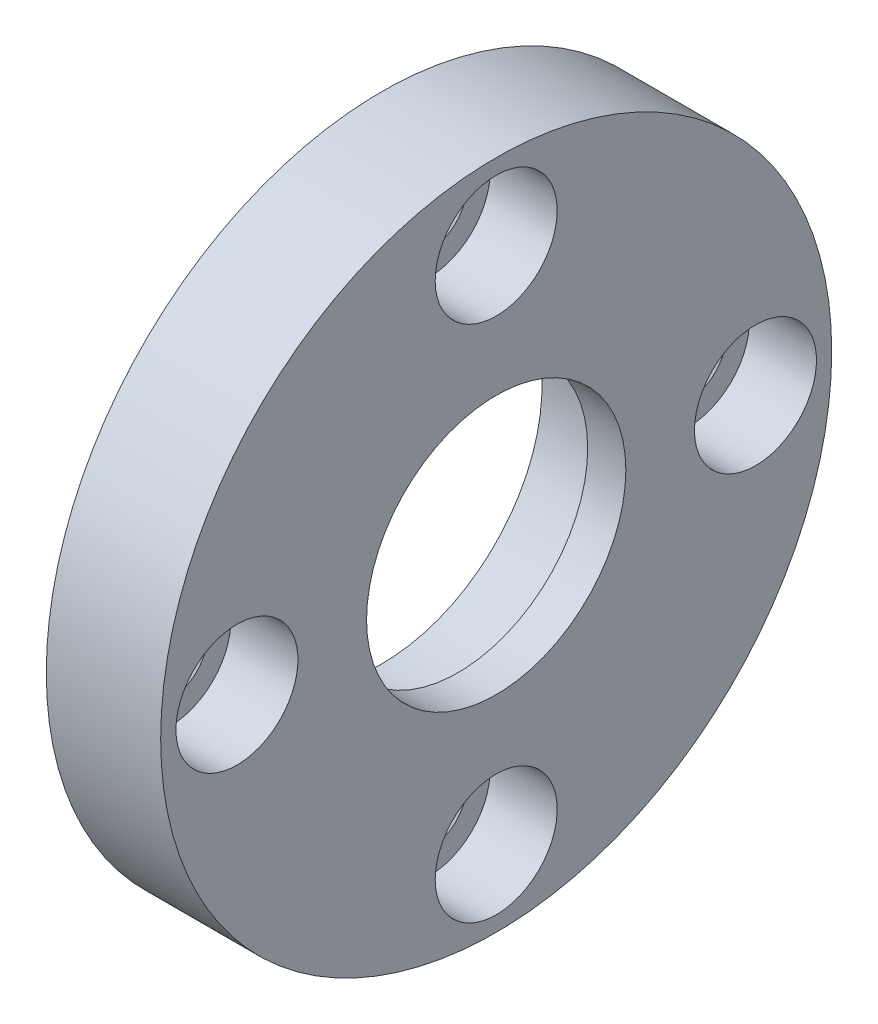
ISO-10303-21;
HEADER;
FILE_DESCRIPTION(('STEP AP214'),'2;1');
FILE_NAME('part.step','',(''),(''),'','','');
FILE_SCHEMA(('AUTOMOTIVE_DESIGN { 1 0 10303 214 1 1 1 1 }'));
ENDSEC;
DATA;
#1=APPLICATION_CONTEXT('core data for automotive mechanical design processes');
#2=APPLICATION_PROTOCOL_DEFINITION('international standard','automotive_design',2000,#1);
#3=PRODUCT_CONTEXT('',#1,'mechanical');
#4=PRODUCT('Part','Part','',(#3));
#5=PRODUCT_RELATED_PRODUCT_CATEGORY('part','',(#4));
#6=PRODUCT_DEFINITION_FORMATION('','',#4);
#7=PRODUCT_DEFINITION_CONTEXT('part definition',#1,'design');
#8=PRODUCT_DEFINITION('design','',#6,#7);
#9=PRODUCT_DEFINITION_SHAPE('','',#8);
#10=(LENGTH_UNIT() NAMED_UNIT(*) SI_UNIT(.MILLI.,.METRE.));
#11=(NAMED_UNIT(*) PLANE_ANGLE_UNIT() SI_UNIT($,.RADIAN.));
#12=(NAMED_UNIT(*) SI_UNIT($,.STERADIAN.) SOLID_ANGLE_UNIT());
#13=UNCERTAINTY_MEASURE_WITH_UNIT(LENGTH_MEASURE(1.E-05),#10,'distance_accuracy_value','');
#14=(GEOMETRIC_REPRESENTATION_CONTEXT(3) GLOBAL_UNCERTAINTY_ASSIGNED_CONTEXT((#13)) GLOBAL_UNIT_ASSIGNED_CONTEXT((#10,
#11,#12)) REPRESENTATION_CONTEXT('',''));
#15=CARTESIAN_POINT('',(0.,0.,0.));
#16=DIRECTION('',(0.,0.,1.));
#17=DIRECTION('',(1.,0.,0.));
#18=AXIS2_PLACEMENT_3D('',#15,#16,#17);
#19=CARTESIAN_POINT('',(-3.75,0.,0.));
#20=DIRECTION('',(1.,0.,0.));
#21=DIRECTION('',(0.,0.,-1.));
#22=AXIS2_PLACEMENT_3D('',#19,#20,#21);
#23=PLANE('',#22);
#24=CARTESIAN_POINT('',(-3.75,0.,-17.));
#25=DIRECTION('',(-1.,0.,0.));
#26=DIRECTION('',(0.,0.,1.));
#27=AXIS2_PLACEMENT_3D('',#24,#25,#26);
#28=CIRCLE('',#27,2.5);
#29=CARTESIAN_POINT('',(-3.75,0.,-14.5));
#30=VERTEX_POINT('',#29);
#31=EDGE_CURVE('E110',#30,#30,#28,.T.);
#32=ORIENTED_EDGE('',*,*,#31,.F.);
#33=EDGE_LOOP('',(#32));
#34=FACE_BOUND('',#33,.T.);
#35=CARTESIAN_POINT('',(-3.75,-17.,0.));
#36=DIRECTION('',(-1.,0.,0.));
#37=DIRECTION('',(0.,0.,1.));
#38=AXIS2_PLACEMENT_3D('',#35,#36,#37);
#39=CIRCLE('',#38,2.5);
#40=CARTESIAN_POINT('',(-3.75,-17.,2.5));
#41=VERTEX_POINT('',#40);
#42=EDGE_CURVE('E92',#41,#41,#39,.T.);
#43=ORIENTED_EDGE('',*,*,#42,.F.);
#44=EDGE_LOOP('',(#43));
#45=FACE_BOUND('',#44,.T.);
#46=CARTESIAN_POINT('',(-3.75,0.,17.));
#47=DIRECTION('',(-1.,0.,0.));
#48=DIRECTION('',(0.,0.,1.));
#49=AXIS2_PLACEMENT_3D('',#46,#47,#48);
#50=CIRCLE('',#49,2.5);
#51=CARTESIAN_POINT('',(-3.75,0.,19.5));
#52=VERTEX_POINT('',#51);
#53=EDGE_CURVE('E74',#52,#52,#50,.T.);
#54=ORIENTED_EDGE('',*,*,#53,.F.);
#55=EDGE_LOOP('',(#54));
#56=FACE_BOUND('',#55,.T.);
#57=CARTESIAN_POINT('',(-3.75,17.,0.));
#58=DIRECTION('',(-1.,0.,0.));
#59=DIRECTION('',(0.,0.,1.));
#60=AXIS2_PLACEMENT_3D('',#57,#58,#59);
#61=CIRCLE('',#60,2.5);
#62=CARTESIAN_POINT('',(-3.75,17.,2.5));
#63=VERTEX_POINT('',#62);
#64=EDGE_CURVE('E56',#63,#63,#61,.T.);
#65=ORIENTED_EDGE('',*,*,#64,.F.);
#66=EDGE_LOOP('',(#65));
#67=FACE_BOUND('',#66,.T.);
#68=CARTESIAN_POINT('',(-3.75,0.,0.));
#69=DIRECTION('',(-1.,0.,0.));
#70=DIRECTION('',(0.,0.,1.));
#71=AXIS2_PLACEMENT_3D('',#68,#69,#70);
#72=CIRCLE('',#71,10.5);
#73=CARTESIAN_POINT('',(-3.75,0.,10.5));
#74=VERTEX_POINT('',#73);
#75=EDGE_CURVE('E41',#74,#74,#72,.T.);
#76=ORIENTED_EDGE('',*,*,#75,.F.);
#77=EDGE_LOOP('',(#76));
#78=FACE_BOUND('',#77,.T.);
#79=CARTESIAN_POINT('',(-3.75,0.,0.));
#80=DIRECTION('',(-1.,0.,0.));
#81=DIRECTION('',(0.,0.,1.));
#82=AXIS2_PLACEMENT_3D('',#79,#80,#81);
#83=CIRCLE('',#82,22.);
#84=CARTESIAN_POINT('',(-3.75,0.,22.));
#85=VERTEX_POINT('',#84);
#86=EDGE_CURVE('E10',#85,#85,#83,.T.);
#87=ORIENTED_EDGE('',*,*,#86,.T.);
#88=EDGE_LOOP('',(#87));
#89=FACE_BOUND('',#88,.T.);
#90=ADVANCED_FACE('F31',(#34,#45,#56,#67,#78,#89),#23,.F.);
#91=CARTESIAN_POINT('',(3.75,0.,0.));
#92=DIRECTION('',(-1.,0.,0.));
#93=DIRECTION('',(0.,0.,1.));
#94=AXIS2_PLACEMENT_3D('',#91,#92,#93);
#95=CYLINDRICAL_SURFACE('',#94,22.);
#96=ORIENTED_EDGE('',*,*,#86,.F.);
#97=EDGE_LOOP('',(#96));
#98=FACE_BOUND('',#97,.T.);
#99=CARTESIAN_POINT('',(3.75,0.,0.));
#100=DIRECTION('',(-1.,0.,0.));
#101=DIRECTION('',(0.,0.,1.));
#102=AXIS2_PLACEMENT_3D('',#99,#100,#101);
#103=CIRCLE('',#102,22.);
#104=CARTESIAN_POINT('',(3.75,0.,22.));
#105=VERTEX_POINT('',#104);
#106=EDGE_CURVE('E37',#105,#105,#103,.T.);
#107=ORIENTED_EDGE('',*,*,#106,.T.);
#108=EDGE_LOOP('',(#107));
#109=FACE_BOUND('',#108,.T.);
#110=ADVANCED_FACE('F144',(#98,#109),#95,.T.);
#111=CARTESIAN_POINT('',(3.75,22.,0.));
#112=DIRECTION('',(-1.,0.,0.));
#113=DIRECTION('',(0.,0.,1.));
#114=AXIS2_PLACEMENT_3D('',#111,#112,#113);
#115=PLANE('',#114);
#116=CARTESIAN_POINT('',(3.75,0.,-17.));
#117=DIRECTION('',(-1.,0.,0.));
#118=DIRECTION('',(0.,0.,1.));
#119=AXIS2_PLACEMENT_3D('',#116,#117,#118);
#120=CIRCLE('',#119,4.);
#121=CARTESIAN_POINT('',(3.75,0.,-13.));
#122=VERTEX_POINT('',#121);
#123=EDGE_CURVE('E125',#122,#122,#120,.T.);
#124=ORIENTED_EDGE('',*,*,#123,.T.);
#125=EDGE_LOOP('',(#124));
#126=FACE_BOUND('',#125,.T.);
#127=CARTESIAN_POINT('',(3.75,-17.,0.));
#128=DIRECTION('',(-1.,0.,0.));
#129=DIRECTION('',(0.,0.,1.));
#130=AXIS2_PLACEMENT_3D('',#127,#128,#129);
#131=CIRCLE('',#130,4.);
#132=CARTESIAN_POINT('',(3.75,-17.,4.));
#133=VERTEX_POINT('',#132);
#134=EDGE_CURVE('E107',#133,#133,#131,.T.);
#135=ORIENTED_EDGE('',*,*,#134,.T.);
#136=EDGE_LOOP('',(#135));
#137=FACE_BOUND('',#136,.T.);
#138=CARTESIAN_POINT('',(3.75,0.,17.));
#139=DIRECTION('',(-1.,0.,0.));
#140=DIRECTION('',(0.,0.,1.));
#141=AXIS2_PLACEMENT_3D('',#138,#139,#140);
#142=CIRCLE('',#141,4.);
#143=CARTESIAN_POINT('',(3.75,0.,21.));
#144=VERTEX_POINT('',#143);
#145=EDGE_CURVE('E89',#144,#144,#142,.T.);
#146=ORIENTED_EDGE('',*,*,#145,.T.);
#147=EDGE_LOOP('',(#146));
#148=FACE_BOUND('',#147,.T.);
#149=CARTESIAN_POINT('',(3.75,17.,0.));
#150=DIRECTION('',(-1.,0.,0.));
#151=DIRECTION('',(0.,0.,1.));
#152=AXIS2_PLACEMENT_3D('',#149,#150,#151);
#153=CIRCLE('',#152,4.);
#154=CARTESIAN_POINT('',(3.75,17.,4.));
#155=VERTEX_POINT('',#154);
#156=EDGE_CURVE('E71',#155,#155,#153,.T.);
#157=ORIENTED_EDGE('',*,*,#156,.T.);
#158=EDGE_LOOP('',(#157));
#159=FACE_BOUND('',#158,.T.);
#160=CARTESIAN_POINT('',(3.75,0.,0.));
#161=DIRECTION('',(-1.,0.,0.));
#162=DIRECTION('',(0.,0.,1.));
#163=AXIS2_PLACEMENT_3D('',#160,#161,#162);
#164=CIRCLE('',#163,8.5);
#165=CARTESIAN_POINT('',(3.75,0.,8.5));
#166=VERTEX_POINT('',#165);
#167=EDGE_CURVE('E53',#166,#166,#164,.T.);
#168=ORIENTED_EDGE('',*,*,#167,.T.);
#169=EDGE_LOOP('',(#168));
#170=FACE_BOUND('',#169,.T.);
#171=ORIENTED_EDGE('',*,*,#106,.F.);
#172=EDGE_LOOP('',(#171));
#173=FACE_BOUND('',#172,.T.);
#174=ADVANCED_FACE('F129',(#126,#137,#148,#159,#170,#173),#115,.F.);
#175=CARTESIAN_POINT('',(3.75,0.,0.));
#176=DIRECTION('',(-1.,0.,0.));
#177=DIRECTION('',(0.,0.,1.));
#178=AXIS2_PLACEMENT_3D('',#175,#176,#177);
#179=CYLINDRICAL_SURFACE('',#178,10.5);
#180=ORIENTED_EDGE('',*,*,#75,.T.);
#181=EDGE_LOOP('',(#180));
#182=FACE_BOUND('',#181,.T.);
#183=CARTESIAN_POINT('',(1.25,0.,0.));
#184=DIRECTION('',(-1.,0.,0.));
#185=DIRECTION('',(0.,0.,1.));
#186=AXIS2_PLACEMENT_3D('',#183,#184,#185);
#187=CIRCLE('',#186,10.5);
#188=CARTESIAN_POINT('',(1.25,0.,10.5));
#189=VERTEX_POINT('',#188);
#190=EDGE_CURVE('E45',#189,#189,#187,.T.);
#191=ORIENTED_EDGE('',*,*,#190,.F.);
#192=EDGE_LOOP('',(#191));
#193=FACE_BOUND('',#192,.T.);
#194=ADVANCED_FACE('F160',(#182,#193),#179,.F.);
#195=CARTESIAN_POINT('',(1.25,10.5,0.));
#196=DIRECTION('',(-1.,0.,0.));
#197=DIRECTION('',(0.,0.,1.));
#198=AXIS2_PLACEMENT_3D('',#195,#196,#197);
#199=PLANE('',#198);
#200=ORIENTED_EDGE('',*,*,#190,.T.);
#201=EDGE_LOOP('',(#200));
#202=FACE_BOUND('',#201,.T.);
#203=CARTESIAN_POINT('',(1.25,0.,0.));
#204=DIRECTION('',(-1.,0.,0.));
#205=DIRECTION('',(0.,0.,1.));
#206=AXIS2_PLACEMENT_3D('',#203,#204,#205);
#207=CIRCLE('',#206,8.5);
#208=CARTESIAN_POINT('',(1.25,0.,8.5));
#209=VERTEX_POINT('',#208);
#210=EDGE_CURVE('E50',#209,#209,#207,.T.);
#211=ORIENTED_EDGE('',*,*,#210,.F.);
#212=EDGE_LOOP('',(#211));
#213=FACE_BOUND('',#212,.T.);
#214=ADVANCED_FACE('F163',(#202,#213),#199,.T.);
#215=CARTESIAN_POINT('',(3.75,0.,0.));
#216=DIRECTION('',(-1.,0.,0.));
#217=DIRECTION('',(0.,0.,1.));
#218=AXIS2_PLACEMENT_3D('',#215,#216,#217);
#219=CYLINDRICAL_SURFACE('',#218,8.5);
#220=ORIENTED_EDGE('',*,*,#210,.T.);
#221=EDGE_LOOP('',(#220));
#222=FACE_BOUND('',#221,.T.);
#223=ORIENTED_EDGE('',*,*,#167,.F.);
#224=EDGE_LOOP('',(#223));
#225=FACE_BOUND('',#224,.T.);
#226=ADVANCED_FACE('F169',(#222,#225),#219,.F.);
#227=CARTESIAN_POINT('',(-3.317,17.,0.));
#228=DIRECTION('',(-1.,0.,0.));
#229=DIRECTION('',(0.,0.,1.));
#230=AXIS2_PLACEMENT_3D('',#227,#228,#229);
#231=CONICAL_SURFACE('',#230,2.067,0.785398163397448);
#232=ORIENTED_EDGE('',*,*,#64,.T.);
#233=EDGE_LOOP('',(#232));
#234=FACE_BOUND('',#233,.T.);
#235=CARTESIAN_POINT('',(-3.317,17.,0.));
#236=DIRECTION('',(-1.,0.,0.));
#237=DIRECTION('',(0.,0.,1.));
#238=AXIS2_PLACEMENT_3D('',#235,#236,#237);
#239=CIRCLE('',#238,2.067);
#240=CARTESIAN_POINT('',(-3.317,17.,2.067));
#241=VERTEX_POINT('',#240);
#242=EDGE_CURVE('E59',#241,#241,#239,.T.);
#243=ORIENTED_EDGE('',*,*,#242,.F.);
#244=EDGE_LOOP('',(#243));
#245=FACE_BOUND('',#244,.T.);
#246=ADVANCED_FACE('F175',(#234,#245),#231,.F.);
#247=CARTESIAN_POINT('',(3.75,17.,0.));
#248=DIRECTION('',(-1.,0.,0.));
#249=DIRECTION('',(0.,0.,1.));
#250=AXIS2_PLACEMENT_3D('',#247,#248,#249);
#251=CYLINDRICAL_SURFACE('',#250,2.067);
#252=ORIENTED_EDGE('',*,*,#242,.T.);
#253=EDGE_LOOP('',(#252));
#254=FACE_BOUND('',#253,.T.);
#255=CARTESIAN_POINT('',(-1.083,17.,0.));
#256=DIRECTION('',(-1.,0.,0.));
#257=DIRECTION('',(0.,0.,1.));
#258=AXIS2_PLACEMENT_3D('',#255,#256,#257);
#259=CIRCLE('',#258,2.067);
#260=CARTESIAN_POINT('',(-1.083,17.,2.067));
#261=VERTEX_POINT('',#260);
#262=EDGE_CURVE('E62',#261,#261,#259,.T.);
#263=ORIENTED_EDGE('',*,*,#262,.F.);
#264=EDGE_LOOP('',(#263));
#265=FACE_BOUND('',#264,.T.);
#266=ADVANCED_FACE('F187',(#254,#265),#251,.F.);
#267=CARTESIAN_POINT('',(-0.65,17.,0.));
#268=DIRECTION('',(1.,0.,0.));
#269=DIRECTION('',(0.,0.,-1.));
#270=AXIS2_PLACEMENT_3D('',#267,#268,#269);
#271=CONICAL_SURFACE('',#270,2.5,0.785398163397447);
#272=ORIENTED_EDGE('',*,*,#262,.T.);
#273=EDGE_LOOP('',(#272));
#274=FACE_BOUND('',#273,.T.);
#275=CARTESIAN_POINT('',(-0.65,17.,0.));
#276=DIRECTION('',(-1.,0.,0.));
#277=DIRECTION('',(0.,0.,1.));
#278=AXIS2_PLACEMENT_3D('',#275,#276,#277);
#279=CIRCLE('',#278,2.5);
#280=CARTESIAN_POINT('',(-0.65,17.,2.5));
#281=VERTEX_POINT('',#280);
#282=EDGE_CURVE('E65',#281,#281,#279,.T.);
#283=ORIENTED_EDGE('',*,*,#282,.F.);
#284=EDGE_LOOP('',(#283));
#285=FACE_BOUND('',#284,.T.);
#286=ADVANCED_FACE('F191',(#274,#285),#271,.F.);
#287=CARTESIAN_POINT('',(-0.65,19.5,0.));
#288=DIRECTION('',(1.,0.,0.));
#289=DIRECTION('',(0.,0.,-1.));
#290=AXIS2_PLACEMENT_3D('',#287,#288,#289);
#291=PLANE('',#290);
#292=ORIENTED_EDGE('',*,*,#282,.T.);
#293=EDGE_LOOP('',(#292));
#294=FACE_BOUND('',#293,.T.);
#295=CARTESIAN_POINT('',(-0.65,17.,0.));
#296=DIRECTION('',(-1.,0.,0.));
#297=DIRECTION('',(0.,0.,1.));
#298=AXIS2_PLACEMENT_3D('',#295,#296,#297);
#299=CIRCLE('',#298,4.);
#300=CARTESIAN_POINT('',(-0.65,17.,4.));
#301=VERTEX_POINT('',#300);
#302=EDGE_CURVE('E68',#301,#301,#299,.T.);
#303=ORIENTED_EDGE('',*,*,#302,.F.);
#304=EDGE_LOOP('',(#303));
#305=FACE_BOUND('',#304,.T.);
#306=ADVANCED_FACE('F195',(#294,#305),#291,.T.);
#307=CARTESIAN_POINT('',(3.75,17.,0.));
#308=DIRECTION('',(-1.,0.,0.));
#309=DIRECTION('',(0.,0.,1.));
#310=AXIS2_PLACEMENT_3D('',#307,#308,#309);
#311=CYLINDRICAL_SURFACE('',#310,4.);
#312=ORIENTED_EDGE('',*,*,#302,.T.);
#313=EDGE_LOOP('',(#312));
#314=FACE_BOUND('',#313,.T.);
#315=ORIENTED_EDGE('',*,*,#156,.F.);
#316=EDGE_LOOP('',(#315));
#317=FACE_BOUND('',#316,.T.);
#318=ADVANCED_FACE('F199',(#314,#317),#311,.F.);
#319=CARTESIAN_POINT('',(-3.317,0.,17.));
#320=DIRECTION('',(-1.,0.,0.));
#321=DIRECTION('',(0.,0.,1.));
#322=AXIS2_PLACEMENT_3D('',#319,#320,#321);
#323=CONICAL_SURFACE('',#322,2.067,0.785398163397448);
#324=ORIENTED_EDGE('',*,*,#53,.T.);
#325=EDGE_LOOP('',(#324));
#326=FACE_BOUND('',#325,.T.);
#327=CARTESIAN_POINT('',(-3.317,0.,17.));
#328=DIRECTION('',(-1.,0.,0.));
#329=DIRECTION('',(0.,0.,1.));
#330=AXIS2_PLACEMENT_3D('',#327,#328,#329);
#331=CIRCLE('',#330,2.067);
#332=CARTESIAN_POINT('',(-3.317,0.,19.067));
#333=VERTEX_POINT('',#332);
#334=EDGE_CURVE('E77',#333,#333,#331,.T.);
#335=ORIENTED_EDGE('',*,*,#334,.F.);
#336=EDGE_LOOP('',(#335));
#337=FACE_BOUND('',#336,.T.);
#338=ADVANCED_FACE('F203',(#326,#337),#323,.F.);
#339=CARTESIAN_POINT('',(3.75,0.,17.));
#340=DIRECTION('',(-1.,0.,0.));
#341=DIRECTION('',(0.,0.,1.));
#342=AXIS2_PLACEMENT_3D('',#339,#340,#341);
#343=CYLINDRICAL_SURFACE('',#342,2.067);
#344=ORIENTED_EDGE('',*,*,#334,.T.);
#345=EDGE_LOOP('',(#344));
#346=FACE_BOUND('',#345,.T.);
#347=CARTESIAN_POINT('',(-1.083,0.,17.));
#348=DIRECTION('',(-1.,0.,0.));
#349=DIRECTION('',(0.,0.,1.));
#350=AXIS2_PLACEMENT_3D('',#347,#348,#349);
#351=CIRCLE('',#350,2.067);
#352=CARTESIAN_POINT('',(-1.083,0.,19.067));
#353=VERTEX_POINT('',#352);
#354=EDGE_CURVE('E80',#353,#353,#351,.T.);
#355=ORIENTED_EDGE('',*,*,#354,.F.);
#356=EDGE_LOOP('',(#355));
#357=FACE_BOUND('',#356,.T.);
#358=ADVANCED_FACE('F207',(#346,#357),#343,.F.);
#359=CARTESIAN_POINT('',(-0.65,0.,17.));
#360=DIRECTION('',(1.,0.,0.));
#361=DIRECTION('',(0.,0.,-1.));
#362=AXIS2_PLACEMENT_3D('',#359,#360,#361);
#363=CONICAL_SURFACE('',#362,2.5,0.785398163397447);
#364=ORIENTED_EDGE('',*,*,#354,.T.);
#365=EDGE_LOOP('',(#364));
#366=FACE_BOUND('',#365,.T.);
#367=CARTESIAN_POINT('',(-0.65,0.,17.));
#368=DIRECTION('',(-1.,0.,0.));
#369=DIRECTION('',(0.,0.,1.));
#370=AXIS2_PLACEMENT_3D('',#367,#368,#369);
#371=CIRCLE('',#370,2.5);
#372=CARTESIAN_POINT('',(-0.65,0.,19.5));
#373=VERTEX_POINT('',#372);
#374=EDGE_CURVE('E83',#373,#373,#371,.T.);
#375=ORIENTED_EDGE('',*,*,#374,.F.);
#376=EDGE_LOOP('',(#375));
#377=FACE_BOUND('',#376,.T.);
#378=ADVANCED_FACE('F211',(#366,#377),#363,.F.);
#379=CARTESIAN_POINT('',(-0.65,2.5,17.));
#380=DIRECTION('',(1.,0.,0.));
#381=DIRECTION('',(0.,0.,-1.));
#382=AXIS2_PLACEMENT_3D('',#379,#380,#381);
#383=PLANE('',#382);
#384=ORIENTED_EDGE('',*,*,#374,.T.);
#385=EDGE_LOOP('',(#384));
#386=FACE_BOUND('',#385,.T.);
#387=CARTESIAN_POINT('',(-0.65,0.,17.));
#388=DIRECTION('',(-1.,0.,0.));
#389=DIRECTION('',(0.,0.,1.));
#390=AXIS2_PLACEMENT_3D('',#387,#388,#389);
#391=CIRCLE('',#390,4.);
#392=CARTESIAN_POINT('',(-0.65,0.,21.));
#393=VERTEX_POINT('',#392);
#394=EDGE_CURVE('E86',#393,#393,#391,.T.);
#395=ORIENTED_EDGE('',*,*,#394,.F.);
#396=EDGE_LOOP('',(#395));
#397=FACE_BOUND('',#396,.T.);
#398=ADVANCED_FACE('F215',(#386,#397),#383,.T.);
#399=CARTESIAN_POINT('',(3.75,0.,17.));
#400=DIRECTION('',(-1.,0.,0.));
#401=DIRECTION('',(0.,0.,1.));
#402=AXIS2_PLACEMENT_3D('',#399,#400,#401);
#403=CYLINDRICAL_SURFACE('',#402,4.);
#404=ORIENTED_EDGE('',*,*,#394,.T.);
#405=EDGE_LOOP('',(#404));
#406=FACE_BOUND('',#405,.T.);
#407=ORIENTED_EDGE('',*,*,#145,.F.);
#408=EDGE_LOOP('',(#407));
#409=FACE_BOUND('',#408,.T.);
#410=ADVANCED_FACE('F219',(#406,#409),#403,.F.);
#411=CARTESIAN_POINT('',(-3.317,-17.,0.));
#412=DIRECTION('',(-1.,0.,0.));
#413=DIRECTION('',(0.,0.,1.));
#414=AXIS2_PLACEMENT_3D('',#411,#412,#413);
#415=CONICAL_SURFACE('',#414,2.067,0.785398163397448);
#416=ORIENTED_EDGE('',*,*,#42,.T.);
#417=EDGE_LOOP('',(#416));
#418=FACE_BOUND('',#417,.T.);
#419=CARTESIAN_POINT('',(-3.317,-17.,0.));
#420=DIRECTION('',(-1.,0.,0.));
#421=DIRECTION('',(0.,0.,1.));
#422=AXIS2_PLACEMENT_3D('',#419,#420,#421);
#423=CIRCLE('',#422,2.067);
#424=CARTESIAN_POINT('',(-3.317,-17.,2.067));
#425=VERTEX_POINT('',#424);
#426=EDGE_CURVE('E95',#425,#425,#423,.T.);
#427=ORIENTED_EDGE('',*,*,#426,.F.);
#428=EDGE_LOOP('',(#427));
#429=FACE_BOUND('',#428,.T.);
#430=ADVANCED_FACE('F223',(#418,#429),#415,.F.);
#431=CARTESIAN_POINT('',(3.75,-17.,0.));
#432=DIRECTION('',(-1.,0.,0.));
#433=DIRECTION('',(0.,0.,1.));
#434=AXIS2_PLACEMENT_3D('',#431,#432,#433);
#435=CYLINDRICAL_SURFACE('',#434,2.067);
#436=ORIENTED_EDGE('',*,*,#426,.T.);
#437=EDGE_LOOP('',(#436));
#438=FACE_BOUND('',#437,.T.);
#439=CARTESIAN_POINT('',(-1.083,-17.,0.));
#440=DIRECTION('',(-1.,0.,0.));
#441=DIRECTION('',(0.,0.,1.));
#442=AXIS2_PLACEMENT_3D('',#439,#440,#441);
#443=CIRCLE('',#442,2.067);
#444=CARTESIAN_POINT('',(-1.083,-17.,2.067));
#445=VERTEX_POINT('',#444);
#446=EDGE_CURVE('E98',#445,#445,#443,.T.);
#447=ORIENTED_EDGE('',*,*,#446,.F.);
#448=EDGE_LOOP('',(#447));
#449=FACE_BOUND('',#448,.T.);
#450=ADVANCED_FACE('F227',(#438,#449),#435,.F.);
#451=CARTESIAN_POINT('',(-0.65,-17.,0.));
#452=DIRECTION('',(1.,0.,0.));
#453=DIRECTION('',(0.,0.,-1.));
#454=AXIS2_PLACEMENT_3D('',#451,#452,#453);
#455=CONICAL_SURFACE('',#454,2.5,0.785398163397447);
#456=ORIENTED_EDGE('',*,*,#446,.T.);
#457=EDGE_LOOP('',(#456));
#458=FACE_BOUND('',#457,.T.);
#459=CARTESIAN_POINT('',(-0.65,-17.,0.));
#460=DIRECTION('',(-1.,0.,0.));
#461=DIRECTION('',(0.,0.,1.));
#462=AXIS2_PLACEMENT_3D('',#459,#460,#461);
#463=CIRCLE('',#462,2.5);
#464=CARTESIAN_POINT('',(-0.65,-17.,2.5));
#465=VERTEX_POINT('',#464);
#466=EDGE_CURVE('E101',#465,#465,#463,.T.);
#467=ORIENTED_EDGE('',*,*,#466,.F.);
#468=EDGE_LOOP('',(#467));
#469=FACE_BOUND('',#468,.T.);
#470=ADVANCED_FACE('F231',(#458,#469),#455,.F.);
#471=CARTESIAN_POINT('',(-0.65,-14.5,0.));
#472=DIRECTION('',(1.,0.,0.));
#473=DIRECTION('',(0.,0.,-1.));
#474=AXIS2_PLACEMENT_3D('',#471,#472,#473);
#475=PLANE('',#474);
#476=ORIENTED_EDGE('',*,*,#466,.T.);
#477=EDGE_LOOP('',(#476));
#478=FACE_BOUND('',#477,.T.);
#479=CARTESIAN_POINT('',(-0.65,-17.,0.));
#480=DIRECTION('',(-1.,0.,0.));
#481=DIRECTION('',(0.,0.,1.));
#482=AXIS2_PLACEMENT_3D('',#479,#480,#481);
#483=CIRCLE('',#482,4.);
#484=CARTESIAN_POINT('',(-0.65,-17.,4.));
#485=VERTEX_POINT('',#484);
#486=EDGE_CURVE('E104',#485,#485,#483,.T.);
#487=ORIENTED_EDGE('',*,*,#486,.F.);
#488=EDGE_LOOP('',(#487));
#489=FACE_BOUND('',#488,.T.);
#490=ADVANCED_FACE('F235',(#478,#489),#475,.T.);
#491=CARTESIAN_POINT('',(3.75,-17.,0.));
#492=DIRECTION('',(-1.,0.,0.));
#493=DIRECTION('',(0.,0.,1.));
#494=AXIS2_PLACEMENT_3D('',#491,#492,#493);
#495=CYLINDRICAL_SURFACE('',#494,4.);
#496=ORIENTED_EDGE('',*,*,#486,.T.);
#497=EDGE_LOOP('',(#496));
#498=FACE_BOUND('',#497,.T.);
#499=ORIENTED_EDGE('',*,*,#134,.F.);
#500=EDGE_LOOP('',(#499));
#501=FACE_BOUND('',#500,.T.);
#502=ADVANCED_FACE('F239',(#498,#501),#495,.F.);
#503=CARTESIAN_POINT('',(-3.317,0.,-17.));
#504=DIRECTION('',(-1.,0.,0.));
#505=DIRECTION('',(0.,0.,1.));
#506=AXIS2_PLACEMENT_3D('',#503,#504,#505);
#507=CONICAL_SURFACE('',#506,2.067,0.785398163397448);
#508=ORIENTED_EDGE('',*,*,#31,.T.);
#509=EDGE_LOOP('',(#508));
#510=FACE_BOUND('',#509,.T.);
#511=CARTESIAN_POINT('',(-3.317,0.,-17.));
#512=DIRECTION('',(-1.,0.,0.));
#513=DIRECTION('',(0.,0.,1.));
#514=AXIS2_PLACEMENT_3D('',#511,#512,#513);
#515=CIRCLE('',#514,2.067);
#516=CARTESIAN_POINT('',(-3.317,0.,-14.933));
#517=VERTEX_POINT('',#516);
#518=EDGE_CURVE('E113',#517,#517,#515,.T.);
#519=ORIENTED_EDGE('',*,*,#518,.F.);
#520=EDGE_LOOP('',(#519));
#521=FACE_BOUND('',#520,.T.);
#522=ADVANCED_FACE('F243',(#510,#521),#507,.F.);
#523=CARTESIAN_POINT('',(3.75,0.,-17.));
#524=DIRECTION('',(-1.,0.,0.));
#525=DIRECTION('',(0.,0.,1.));
#526=AXIS2_PLACEMENT_3D('',#523,#524,#525);
#527=CYLINDRICAL_SURFACE('',#526,2.067);
#528=ORIENTED_EDGE('',*,*,#518,.T.);
#529=EDGE_LOOP('',(#528));
#530=FACE_BOUND('',#529,.T.);
#531=CARTESIAN_POINT('',(-1.083,0.,-17.));
#532=DIRECTION('',(-1.,0.,0.));
#533=DIRECTION('',(0.,0.,1.));
#534=AXIS2_PLACEMENT_3D('',#531,#532,#533);
#535=CIRCLE('',#534,2.067);
#536=CARTESIAN_POINT('',(-1.083,0.,-14.933));
#537=VERTEX_POINT('',#536);
#538=EDGE_CURVE('E116',#537,#537,#535,.T.);
#539=ORIENTED_EDGE('',*,*,#538,.F.);
#540=EDGE_LOOP('',(#539));
#541=FACE_BOUND('',#540,.T.);
#542=ADVANCED_FACE('F247',(#530,#541),#527,.F.);
#543=CARTESIAN_POINT('',(-0.65,0.,-17.));
#544=DIRECTION('',(1.,0.,0.));
#545=DIRECTION('',(0.,0.,-1.));
#546=AXIS2_PLACEMENT_3D('',#543,#544,#545);
#547=CONICAL_SURFACE('',#546,2.5,0.785398163397447);
#548=ORIENTED_EDGE('',*,*,#538,.T.);
#549=EDGE_LOOP('',(#548));
#550=FACE_BOUND('',#549,.T.);
#551=CARTESIAN_POINT('',(-0.65,0.,-17.));
#552=DIRECTION('',(-1.,0.,0.));
#553=DIRECTION('',(0.,0.,1.));
#554=AXIS2_PLACEMENT_3D('',#551,#552,#553);
#555=CIRCLE('',#554,2.5);
#556=CARTESIAN_POINT('',(-0.65,0.,-14.5));
#557=VERTEX_POINT('',#556);
#558=EDGE_CURVE('E119',#557,#557,#555,.T.);
#559=ORIENTED_EDGE('',*,*,#558,.F.);
#560=EDGE_LOOP('',(#559));
#561=FACE_BOUND('',#560,.T.);
#562=ADVANCED_FACE('F140',(#550,#561),#547,.F.);
#563=CARTESIAN_POINT('',(-0.65,2.5,-17.));
#564=DIRECTION('',(1.,0.,0.));
#565=DIRECTION('',(0.,0.,-1.));
#566=AXIS2_PLACEMENT_3D('',#563,#564,#565);
#567=PLANE('',#566);
#568=ORIENTED_EDGE('',*,*,#558,.T.);
#569=EDGE_LOOP('',(#568));
#570=FACE_BOUND('',#569,.T.);
#571=CARTESIAN_POINT('',(-0.65,0.,-17.));
#572=DIRECTION('',(-1.,0.,0.));
#573=DIRECTION('',(0.,0.,1.));
#574=AXIS2_PLACEMENT_3D('',#571,#572,#573);
#575=CIRCLE('',#574,4.);
#576=CARTESIAN_POINT('',(-0.65,0.,-13.));
#577=VERTEX_POINT('',#576);
#578=EDGE_CURVE('E122',#577,#577,#575,.T.);
#579=ORIENTED_EDGE('',*,*,#578,.F.);
#580=EDGE_LOOP('',(#579));
#581=FACE_BOUND('',#580,.T.);
#582=ADVANCED_FACE('F134',(#570,#581),#567,.T.);
#583=CARTESIAN_POINT('',(3.75,0.,-17.));
#584=DIRECTION('',(-1.,0.,0.));
#585=DIRECTION('',(0.,0.,1.));
#586=AXIS2_PLACEMENT_3D('',#583,#584,#585);
#587=CYLINDRICAL_SURFACE('',#586,4.);
#588=ORIENTED_EDGE('',*,*,#578,.T.);
#589=EDGE_LOOP('',(#588));
#590=FACE_BOUND('',#589,.T.);
#591=ORIENTED_EDGE('',*,*,#123,.F.);
#592=EDGE_LOOP('',(#591));
#593=FACE_BOUND('',#592,.T.);
#594=ADVANCED_FACE('F132',(#590,#593),#587,.F.);
#595=CLOSED_SHELL('',(#90,#110,#174,#194,#214,#226,#246,#266,#286,#306,#318,#338,#358,#378,#398,
#410,#430,#450,#470,#490,#502,#522,#542,#562,#582,#594));
#596=MANIFOLD_SOLID_BREP('B2',#595);
#597=ADVANCED_BREP_SHAPE_REPRESENTATION('',(#18,#596),#14);
#598=SHAPE_DEFINITION_REPRESENTATION(#9,#597);
ENDSEC;
END-ISO-10303-21;
